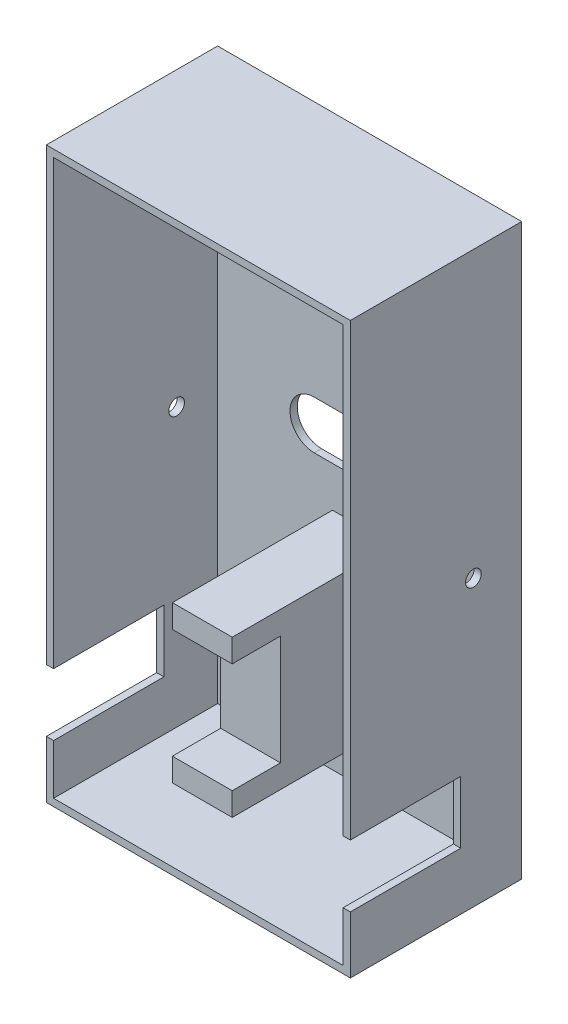
ISO-10303-21;
HEADER;
FILE_DESCRIPTION(('STEP AP214'),'2;1');
FILE_NAME('part.step','',(''),(''),'','','');
FILE_SCHEMA(('AUTOMOTIVE_DESIGN { 1 0 10303 214 1 1 1 1 }'));
ENDSEC;
DATA;
#1=APPLICATION_CONTEXT('core data for automotive mechanical design processes');
#2=APPLICATION_PROTOCOL_DEFINITION('international standard','automotive_design',2000,#1);
#3=PRODUCT_CONTEXT('',#1,'mechanical');
#4=PRODUCT('Part','Part','',(#3));
#5=PRODUCT_RELATED_PRODUCT_CATEGORY('part','',(#4));
#6=PRODUCT_DEFINITION_FORMATION('','',#4);
#7=PRODUCT_DEFINITION_CONTEXT('part definition',#1,'design');
#8=PRODUCT_DEFINITION('design','',#6,#7);
#9=PRODUCT_DEFINITION_SHAPE('','',#8);
#10=(LENGTH_UNIT() NAMED_UNIT(*) SI_UNIT(.MILLI.,.METRE.));
#11=(NAMED_UNIT(*) PLANE_ANGLE_UNIT() SI_UNIT($,.RADIAN.));
#12=(NAMED_UNIT(*) SI_UNIT($,.STERADIAN.) SOLID_ANGLE_UNIT());
#13=UNCERTAINTY_MEASURE_WITH_UNIT(LENGTH_MEASURE(1.E-05),#10,'distance_accuracy_value','');
#14=(GEOMETRIC_REPRESENTATION_CONTEXT(3) GLOBAL_UNCERTAINTY_ASSIGNED_CONTEXT((#13)) GLOBAL_UNIT_ASSIGNED_CONTEXT((#10,
#11,#12)) REPRESENTATION_CONTEXT('',''));
#15=CARTESIAN_POINT('',(0.,0.,0.));
#16=DIRECTION('',(0.,0.,1.));
#17=DIRECTION('',(1.,0.,0.));
#18=AXIS2_PLACEMENT_3D('',#15,#16,#17);
#19=CARTESIAN_POINT('',(0.,0.,-1.5));
#20=DIRECTION('',(0.,0.,1.));
#21=DIRECTION('',(1.,0.,0.));
#22=AXIS2_PLACEMENT_3D('',#19,#20,#21);
#23=PLANE('',#22);
#24=CARTESIAN_POINT('',(9.95,28.42,-1.5));
#25=DIRECTION('',(0.,0.,-1.));
#26=DIRECTION('',(-1.,0.,0.));
#27=AXIS2_PLACEMENT_3D('',#24,#25,#26);
#28=CIRCLE('',#27,1.52499999999999);
#29=CARTESIAN_POINT('',(8.42500000000001,28.42,-1.5));
#30=VERTEX_POINT('',#29);
#31=EDGE_CURVE('E896',#30,#30,#28,.T.);
#32=ORIENTED_EDGE('',*,*,#31,.F.);
#33=EDGE_LOOP('',(#32));
#34=FACE_BOUND('',#33,.T.);
#35=CARTESIAN_POINT('',(50.05,28.42,-1.5));
#36=DIRECTION('',(0.,0.,-1.));
#37=DIRECTION('',(-1.,0.,0.));
#38=AXIS2_PLACEMENT_3D('',#35,#36,#37);
#39=CIRCLE('',#38,1.52499999999998);
#40=CARTESIAN_POINT('',(48.525,28.42,-1.5));
#41=VERTEX_POINT('',#40);
#42=EDGE_CURVE('E884',#41,#41,#39,.T.);
#43=ORIENTED_EDGE('',*,*,#42,.F.);
#44=EDGE_LOOP('',(#43));
#45=FACE_BOUND('',#44,.T.);
#46=CARTESIAN_POINT('',(50.05,21.935,-1.5));
#47=DIRECTION('',(0.,0.,-1.));
#48=DIRECTION('',(-1.,0.,0.));
#49=AXIS2_PLACEMENT_3D('',#46,#47,#48);
#50=CIRCLE('',#49,1.52499999999998);
#51=CARTESIAN_POINT('',(48.525,21.935,-1.5));
#52=VERTEX_POINT('',#51);
#53=EDGE_CURVE('E879',#52,#52,#50,.T.);
#54=ORIENTED_EDGE('',*,*,#53,.F.);
#55=EDGE_LOOP('',(#54));
#56=FACE_BOUND('',#55,.T.);
#57=DIRECTION('',(-1.,0.,0.));
#58=VECTOR('',#57,1.);
#59=CARTESIAN_POINT('',(40.,55.,-1.5));
#60=LINE('',#59,#58);
#61=CARTESIAN_POINT('',(40.,55.,-1.5));
#62=VERTEX_POINT('',#61);
#63=CARTESIAN_POINT('',(20.,55.,-1.5));
#64=VERTEX_POINT('',#63);
#65=EDGE_CURVE('E233',#62,#64,#60,.T.);
#66=ORIENTED_EDGE('',*,*,#65,.F.);
#67=CARTESIAN_POINT('',(40.,60.,-1.5));
#68=DIRECTION('',(0.,0.,-1.));
#69=DIRECTION('',(-1.,0.,0.));
#70=AXIS2_PLACEMENT_3D('',#67,#68,#69);
#71=CIRCLE('',#70,5.);
#72=CARTESIAN_POINT('',(40.,65.,-1.5));
#73=VERTEX_POINT('',#72);
#74=EDGE_CURVE('E60',#73,#62,#71,.T.);
#75=ORIENTED_EDGE('',*,*,#74,.F.);
#76=DIRECTION('',(1.,0.,0.));
#77=VECTOR('',#76,1.);
#78=CARTESIAN_POINT('',(20.,65.,-1.5));
#79=LINE('',#78,#77);
#80=CARTESIAN_POINT('',(20.,65.,-1.5));
#81=VERTEX_POINT('',#80);
#82=EDGE_CURVE('E239',#81,#73,#79,.T.);
#83=ORIENTED_EDGE('',*,*,#82,.F.);
#84=CARTESIAN_POINT('',(20.,60.,-1.5));
#85=DIRECTION('',(0.,0.,-1.));
#86=DIRECTION('',(-1.,0.,0.));
#87=AXIS2_PLACEMENT_3D('',#84,#85,#86);
#88=CIRCLE('',#87,5.);
#89=EDGE_CURVE('E224',#64,#81,#88,.T.);
#90=ORIENTED_EDGE('',*,*,#89,.F.);
#91=EDGE_LOOP('',(#66,#75,#83,#90));
#92=FACE_BOUND('',#91,.T.);
#93=DIRECTION('',(0.,-1.,0.));
#94=VECTOR('',#93,1.);
#95=CARTESIAN_POINT('',(-1.5,116.5,-1.5));
#96=LINE('',#95,#94);
#97=CARTESIAN_POINT('',(-1.5,116.5,-1.5));
#98=VERTEX_POINT('',#97);
#99=CARTESIAN_POINT('',(-1.5,-1.5,-1.5));
#100=VERTEX_POINT('',#99);
#101=EDGE_CURVE('E403',#98,#100,#96,.T.);
#102=ORIENTED_EDGE('',*,*,#101,.F.);
#103=DIRECTION('',(-1.,0.,0.));
#104=VECTOR('',#103,1.);
#105=CARTESIAN_POINT('',(61.5,116.5,-1.5));
#106=LINE('',#105,#104);
#107=CARTESIAN_POINT('',(61.5,116.5,-1.5));
#108=VERTEX_POINT('',#107);
#109=EDGE_CURVE('E413',#108,#98,#106,.T.);
#110=ORIENTED_EDGE('',*,*,#109,.F.);
#111=DIRECTION('',(0.,1.,0.));
#112=VECTOR('',#111,1.);
#113=CARTESIAN_POINT('',(61.5,-1.5,-1.5));
#114=LINE('',#113,#112);
#115=CARTESIAN_POINT('',(61.5,-1.5,-1.5));
#116=VERTEX_POINT('',#115);
#117=EDGE_CURVE('E410',#116,#108,#114,.T.);
#118=ORIENTED_EDGE('',*,*,#117,.F.);
#119=DIRECTION('',(1.,0.,0.));
#120=VECTOR('',#119,1.);
#121=CARTESIAN_POINT('',(-1.5,-1.5,-1.5));
#122=LINE('',#121,#120);
#123=EDGE_CURVE('E406',#100,#116,#122,.T.);
#124=ORIENTED_EDGE('',*,*,#123,.F.);
#125=EDGE_LOOP('',(#102,#110,#118,#124));
#126=FACE_BOUND('',#125,.T.);
#127=CARTESIAN_POINT('',(9.95,21.935,-1.5));
#128=DIRECTION('',(0.,0.,-1.));
#129=DIRECTION('',(-1.,0.,0.));
#130=AXIS2_PLACEMENT_3D('',#127,#128,#129);
#131=CIRCLE('',#130,1.52499999999999);
#132=CARTESIAN_POINT('',(8.42500000000001,21.935,-1.5));
#133=VERTEX_POINT('',#132);
#134=EDGE_CURVE('E890',#133,#133,#131,.T.);
#135=ORIENTED_EDGE('',*,*,#134,.F.);
#136=EDGE_LOOP('',(#135));
#137=FACE_BOUND('',#136,.T.);
#138=ADVANCED_FACE('F35',(#34,#45,#56,#92,#126,#137),#23,.F.);
#139=CARTESIAN_POINT('',(0.,0.,34.));
#140=DIRECTION('',(0.,0.,1.));
#141=DIRECTION('',(1.,0.,0.));
#142=AXIS2_PLACEMENT_3D('',#139,#140,#141);
#143=PLANE('',#142);
#144=DIRECTION('',(-1.,0.,0.));
#145=VECTOR('',#144,1.);
#146=CARTESIAN_POINT('',(61.501,23.25,34.));
#147=LINE('',#146,#145);
#148=CARTESIAN_POINT('',(0.,23.25,34.));
#149=VERTEX_POINT('',#148);
#150=CARTESIAN_POINT('',(-1.5,23.25,34.));
#151=VERTEX_POINT('',#150);
#152=EDGE_CURVE('E277',#149,#151,#147,.T.);
#153=ORIENTED_EDGE('',*,*,#152,.F.);
#154=DIRECTION('',(0.,-1.,0.));
#155=VECTOR('',#154,1.);
#156=CARTESIAN_POINT('',(0.,115.,34.));
#157=LINE('',#156,#155);
#158=CARTESIAN_POINT('',(0.,115.,34.));
#159=VERTEX_POINT('',#158);
#160=EDGE_CURVE('E383',#159,#149,#157,.T.);
#161=ORIENTED_EDGE('',*,*,#160,.F.);
#162=DIRECTION('',(-1.,0.,0.));
#163=VECTOR('',#162,1.);
#164=CARTESIAN_POINT('',(60.,115.,34.));
#165=LINE('',#164,#163);
#166=CARTESIAN_POINT('',(60.,115.,34.));
#167=VERTEX_POINT('',#166);
#168=EDGE_CURVE('E366',#167,#159,#165,.T.);
#169=ORIENTED_EDGE('',*,*,#168,.F.);
#170=DIRECTION('',(0.,1.,0.));
#171=VECTOR('',#170,1.);
#172=CARTESIAN_POINT('',(60.,0.,34.));
#173=LINE('',#172,#171);
#174=CARTESIAN_POINT('',(60.,23.25,34.));
#175=VERTEX_POINT('',#174);
#176=EDGE_CURVE('E389',#175,#167,#173,.T.);
#177=ORIENTED_EDGE('',*,*,#176,.F.);
#178=DIRECTION('',(1.,0.,0.));
#179=VECTOR('',#178,1.);
#180=CARTESIAN_POINT('',(-1.501,23.25,34.));
#181=LINE('',#180,#179);
#182=CARTESIAN_POINT('',(61.5,23.25,34.));
#183=VERTEX_POINT('',#182);
#184=EDGE_CURVE('E296',#175,#183,#181,.T.);
#185=ORIENTED_EDGE('',*,*,#184,.T.);
#186=DIRECTION('',(0.,1.,0.));
#187=VECTOR('',#186,1.);
#188=CARTESIAN_POINT('',(61.5,-1.5,34.));
#189=LINE('',#188,#187);
#190=CARTESIAN_POINT('',(61.5,116.5,34.));
#191=VERTEX_POINT('',#190);
#192=EDGE_CURVE('E423',#183,#191,#189,.T.);
#193=ORIENTED_EDGE('',*,*,#192,.T.);
#194=DIRECTION('',(-1.,0.,0.));
#195=VECTOR('',#194,1.);
#196=CARTESIAN_POINT('',(61.5,116.5,34.));
#197=LINE('',#196,#195);
#198=CARTESIAN_POINT('',(-1.5,116.5,34.));
#199=VERTEX_POINT('',#198);
#200=EDGE_CURVE('E407',#191,#199,#197,.T.);
#201=ORIENTED_EDGE('',*,*,#200,.T.);
#202=DIRECTION('',(0.,-1.,0.));
#203=VECTOR('',#202,1.);
#204=CARTESIAN_POINT('',(-1.5,116.5,34.));
#205=LINE('',#204,#203);
#206=EDGE_CURVE('E417',#199,#151,#205,.T.);
#207=ORIENTED_EDGE('',*,*,#206,.T.);
#208=EDGE_LOOP('',(#153,#161,#169,#177,#185,#193,#201,#207));
#209=FACE_BOUND('',#208,.T.);
#210=ADVANCED_FACE('F462',(#209),#143,.T.);
#211=CARTESIAN_POINT('',(0.,0.,33.18));
#212=DIRECTION('',(0.,0.,1.));
#213=DIRECTION('',(1.,0.,0.));
#214=AXIS2_PLACEMENT_3D('',#211,#212,#213);
#215=PLANE('',#214);
#216=DIRECTION('',(-1.,0.,0.));
#217=VECTOR('',#216,1.);
#218=CARTESIAN_POINT('',(61.501,41.8,33.18));
#219=LINE('',#218,#217);
#220=CARTESIAN_POINT('',(36.2,41.8,33.18));
#221=VERTEX_POINT('',#220);
#222=CARTESIAN_POINT('',(23.8,41.8,33.18));
#223=VERTEX_POINT('',#222);
#224=EDGE_CURVE('E309',#221,#223,#219,.T.);
#225=ORIENTED_EDGE('',*,*,#224,.F.);
#226=DIRECTION('',(0.,1.,0.));
#227=VECTOR('',#226,1.);
#228=CARTESIAN_POINT('',(36.2,0.,33.18));
#229=LINE('',#228,#227);
#230=CARTESIAN_POINT('',(36.2,46.6,33.18));
#231=VERTEX_POINT('',#230);
#232=EDGE_CURVE('E334',#221,#231,#229,.T.);
#233=ORIENTED_EDGE('',*,*,#232,.T.);
#234=DIRECTION('',(1.,0.,0.));
#235=VECTOR('',#234,1.);
#236=CARTESIAN_POINT('',(0.,46.6,33.18));
#237=LINE('',#236,#235);
#238=CARTESIAN_POINT('',(23.8,46.6,33.18));
#239=VERTEX_POINT('',#238);
#240=EDGE_CURVE('E339',#239,#231,#237,.T.);
#241=ORIENTED_EDGE('',*,*,#240,.F.);
#242=DIRECTION('',(0.,1.,0.));
#243=VECTOR('',#242,1.);
#244=CARTESIAN_POINT('',(23.8,0.,33.18));
#245=LINE('',#244,#243);
#246=EDGE_CURVE('E342',#223,#239,#245,.T.);
#247=ORIENTED_EDGE('',*,*,#246,.F.);
#248=EDGE_LOOP('',(#225,#233,#241,#247));
#249=FACE_BOUND('',#248,.T.);
#250=ADVANCED_FACE('F518',(#249),#215,.T.);
#251=CARTESIAN_POINT('',(0.,0.,0.));
#252=DIRECTION('',(0.,0.,1.));
#253=DIRECTION('',(1.,0.,0.));
#254=AXIS2_PLACEMENT_3D('',#251,#252,#253);
#255=PLANE('',#254);
#256=CARTESIAN_POINT('',(9.95,28.42,0.));
#257=DIRECTION('',(0.,0.,1.));
#258=DIRECTION('',(1.,0.,0.));
#259=AXIS2_PLACEMENT_3D('',#256,#257,#258);
#260=CIRCLE('',#259,1.52499999999999);
#261=CARTESIAN_POINT('',(11.475,28.42,0.));
#262=VERTEX_POINT('',#261);
#263=EDGE_CURVE('E893',#262,#262,#260,.T.);
#264=ORIENTED_EDGE('',*,*,#263,.F.);
#265=EDGE_LOOP('',(#264));
#266=FACE_BOUND('',#265,.T.);
#267=CARTESIAN_POINT('',(9.95,21.935,0.));
#268=DIRECTION('',(0.,0.,1.));
#269=DIRECTION('',(1.,0.,0.));
#270=AXIS2_PLACEMENT_3D('',#267,#268,#269);
#271=CIRCLE('',#270,1.52499999999999);
#272=CARTESIAN_POINT('',(11.475,21.935,0.));
#273=VERTEX_POINT('',#272);
#274=EDGE_CURVE('E887',#273,#273,#271,.T.);
#275=ORIENTED_EDGE('',*,*,#274,.F.);
#276=EDGE_LOOP('',(#275));
#277=FACE_BOUND('',#276,.T.);
#278=CARTESIAN_POINT('',(50.05,28.42,0.));
#279=DIRECTION('',(0.,0.,1.));
#280=DIRECTION('',(1.,0.,0.));
#281=AXIS2_PLACEMENT_3D('',#278,#279,#280);
#282=CIRCLE('',#281,1.52499999999998);
#283=CARTESIAN_POINT('',(51.575,28.42,0.));
#284=VERTEX_POINT('',#283);
#285=EDGE_CURVE('E39',#284,#284,#282,.T.);
#286=ORIENTED_EDGE('',*,*,#285,.F.);
#287=EDGE_LOOP('',(#286));
#288=FACE_BOUND('',#287,.T.);
#289=CARTESIAN_POINT('',(50.05,21.935,0.));
#290=DIRECTION('',(0.,0.,1.));
#291=DIRECTION('',(1.,0.,0.));
#292=AXIS2_PLACEMENT_3D('',#289,#290,#291);
#293=CIRCLE('',#292,1.52499999999998);
#294=CARTESIAN_POINT('',(51.575,21.935,0.));
#295=VERTEX_POINT('',#294);
#296=EDGE_CURVE('E877',#295,#295,#293,.T.);
#297=ORIENTED_EDGE('',*,*,#296,.F.);
#298=EDGE_LOOP('',(#297));
#299=FACE_BOUND('',#298,.T.);
#300=CARTESIAN_POINT('',(40.,60.,0.));
#301=DIRECTION('',(0.,0.,1.));
#302=DIRECTION('',(1.,0.,0.));
#303=AXIS2_PLACEMENT_3D('',#300,#301,#302);
#304=CIRCLE('',#303,5.);
#305=CARTESIAN_POINT('',(40.,55.,0.));
#306=VERTEX_POINT('',#305);
#307=CARTESIAN_POINT('',(40.,65.,0.));
#308=VERTEX_POINT('',#307);
#309=EDGE_CURVE('E253',#306,#308,#304,.T.);
#310=ORIENTED_EDGE('',*,*,#309,.F.);
#311=DIRECTION('',(1.,0.,0.));
#312=VECTOR('',#311,1.);
#313=CARTESIAN_POINT('',(0.,55.,0.));
#314=LINE('',#313,#312);
#315=CARTESIAN_POINT('',(20.,55.,0.));
#316=VERTEX_POINT('',#315);
#317=EDGE_CURVE('E246',#316,#306,#314,.T.);
#318=ORIENTED_EDGE('',*,*,#317,.F.);
#319=CARTESIAN_POINT('',(20.,60.,0.));
#320=DIRECTION('',(0.,0.,1.));
#321=DIRECTION('',(1.,0.,0.));
#322=AXIS2_PLACEMENT_3D('',#319,#320,#321);
#323=CIRCLE('',#322,5.);
#324=CARTESIAN_POINT('',(20.,65.,0.));
#325=VERTEX_POINT('',#324);
#326=EDGE_CURVE('E227',#325,#316,#323,.T.);
#327=ORIENTED_EDGE('',*,*,#326,.F.);
#328=DIRECTION('',(-1.,0.,0.));
#329=VECTOR('',#328,1.);
#330=CARTESIAN_POINT('',(0.,65.,0.));
#331=LINE('',#330,#329);
#332=EDGE_CURVE('E251',#308,#325,#331,.T.);
#333=ORIENTED_EDGE('',*,*,#332,.F.);
#334=EDGE_LOOP('',(#310,#318,#327,#333));
#335=FACE_BOUND('',#334,.T.);
#336=DIRECTION('',(-1.,0.,0.));
#337=VECTOR('',#336,1.);
#338=CARTESIAN_POINT('',(60.,115.,0.));
#339=LINE('',#338,#337);
#340=CARTESIAN_POINT('',(60.,115.,0.));
#341=VERTEX_POINT('',#340);
#342=CARTESIAN_POINT('',(0.,115.,0.));
#343=VERTEX_POINT('',#342);
#344=EDGE_CURVE('E367',#341,#343,#339,.T.);
#345=ORIENTED_EDGE('',*,*,#344,.T.);
#346=DIRECTION('',(0.,-1.,0.));
#347=VECTOR('',#346,1.);
#348=CARTESIAN_POINT('',(0.,115.,0.));
#349=LINE('',#348,#347);
#350=CARTESIAN_POINT('',(0.,0.,0.));
#351=VERTEX_POINT('',#350);
#352=EDGE_CURVE('E370',#343,#351,#349,.T.);
#353=ORIENTED_EDGE('',*,*,#352,.T.);
#354=DIRECTION('',(1.,0.,0.));
#355=VECTOR('',#354,1.);
#356=CARTESIAN_POINT('',(0.,0.,0.));
#357=LINE('',#356,#355);
#358=CARTESIAN_POINT('',(60.,0.,0.));
#359=VERTEX_POINT('',#358);
#360=EDGE_CURVE('E374',#351,#359,#357,.T.);
#361=ORIENTED_EDGE('',*,*,#360,.T.);
#362=DIRECTION('',(0.,1.,0.));
#363=VECTOR('',#362,1.);
#364=CARTESIAN_POINT('',(60.,0.,0.));
#365=LINE('',#364,#363);
#366=EDGE_CURVE('E377',#359,#341,#365,.T.);
#367=ORIENTED_EDGE('',*,*,#366,.T.);
#368=EDGE_LOOP('',(#345,#353,#361,#367));
#369=FACE_BOUND('',#368,.T.);
#370=DIRECTION('',(0.,1.,0.));
#371=VECTOR('',#370,1.);
#372=CARTESIAN_POINT('',(36.2,0.,0.));
#373=LINE('',#372,#371);
#374=CARTESIAN_POINT('',(36.2,14.25,0.));
#375=VERTEX_POINT('',#374);
#376=CARTESIAN_POINT('',(36.2,46.6,0.));
#377=VERTEX_POINT('',#376);
#378=EDGE_CURVE('E349',#375,#377,#373,.T.);
#379=ORIENTED_EDGE('',*,*,#378,.F.);
#380=DIRECTION('',(1.,0.,0.));
#381=VECTOR('',#380,1.);
#382=CARTESIAN_POINT('',(0.,14.25,0.));
#383=LINE('',#382,#381);
#384=CARTESIAN_POINT('',(23.8,14.25,0.));
#385=VERTEX_POINT('',#384);
#386=EDGE_CURVE('E330',#385,#375,#383,.T.);
#387=ORIENTED_EDGE('',*,*,#386,.F.);
#388=DIRECTION('',(0.,1.,0.));
#389=VECTOR('',#388,1.);
#390=CARTESIAN_POINT('',(23.8,0.,0.));
#391=LINE('',#390,#389);
#392=CARTESIAN_POINT('',(23.8,46.6,0.));
#393=VERTEX_POINT('',#392);
#394=EDGE_CURVE('E335',#385,#393,#391,.T.);
#395=ORIENTED_EDGE('',*,*,#394,.T.);
#396=DIRECTION('',(1.,0.,0.));
#397=VECTOR('',#396,1.);
#398=CARTESIAN_POINT('',(0.,46.6,0.));
#399=LINE('',#398,#397);
#400=EDGE_CURVE('E352',#393,#377,#399,.T.);
#401=ORIENTED_EDGE('',*,*,#400,.T.);
#402=EDGE_LOOP('',(#379,#387,#395,#401));
#403=FACE_BOUND('',#402,.T.);
#404=ADVANCED_FACE('F490',(#266,#277,#288,#299,#335,#369,#403),#255,.T.);
#405=CARTESIAN_POINT('',(-1.5,116.5,-1.5));
#406=DIRECTION('',(-1.,0.,0.));
#407=DIRECTION('',(0.,-1.,0.));
#408=AXIS2_PLACEMENT_3D('',#405,#406,#407);
#409=PLANE('',#408);
#410=CARTESIAN_POINT('',(-1.5,57.5,8.5));
#411=DIRECTION('',(1.,0.,0.));
#412=DIRECTION('',(0.,0.,-1.));
#413=AXIS2_PLACEMENT_3D('',#410,#411,#412);
#414=CIRCLE('',#413,1.62559999999998);
#415=CARTESIAN_POINT('',(-1.5,57.5,6.87440000000002));
#416=VERTEX_POINT('',#415);
#417=EDGE_CURVE('E899',#416,#416,#414,.T.);
#418=ORIENTED_EDGE('',*,*,#417,.T.);
#419=EDGE_LOOP('',(#418));
#420=FACE_BOUND('',#419,.T.);
#421=DIRECTION('',(0.,0.,-1.));
#422=VECTOR('',#421,1.);
#423=CARTESIAN_POINT('',(-1.5,23.25,34.));
#424=LINE('',#423,#422);
#425=CARTESIAN_POINT('',(-1.5,23.25,11.13));
#426=VERTEX_POINT('',#425);
#427=EDGE_CURVE('E265',#151,#426,#424,.T.);
#428=ORIENTED_EDGE('',*,*,#427,.F.);
#429=ORIENTED_EDGE('',*,*,#206,.F.);
#430=DIRECTION('',(0.,0.,1.));
#431=VECTOR('',#430,1.);
#432=CARTESIAN_POINT('',(-1.5,116.5,-1.5));
#433=LINE('',#432,#431);
#434=EDGE_CURVE('E11',#98,#199,#433,.T.);
#435=ORIENTED_EDGE('',*,*,#434,.F.);
#436=ORIENTED_EDGE('',*,*,#101,.T.);
#437=DIRECTION('',(0.,0.,1.));
#438=VECTOR('',#437,1.);
#439=CARTESIAN_POINT('',(-1.5,-1.5,-1.5));
#440=LINE('',#439,#438);
#441=CARTESIAN_POINT('',(-1.5,-1.5,34.));
#442=VERTEX_POINT('',#441);
#443=EDGE_CURVE('E416',#100,#442,#440,.T.);
#444=ORIENTED_EDGE('',*,*,#443,.T.);
#445=CARTESIAN_POINT('',(-1.5,10.36,34.));
#446=VERTEX_POINT('',#445);
#447=EDGE_CURVE('E395',#446,#442,#205,.T.);
#448=ORIENTED_EDGE('',*,*,#447,.F.);
#449=DIRECTION('',(0.,0.,1.));
#450=VECTOR('',#449,1.);
#451=CARTESIAN_POINT('',(-1.5,10.36,11.13));
#452=LINE('',#451,#450);
#453=CARTESIAN_POINT('',(-1.5,10.36,11.13));
#454=VERTEX_POINT('',#453);
#455=EDGE_CURVE('E263',#454,#446,#452,.T.);
#456=ORIENTED_EDGE('',*,*,#455,.F.);
#457=DIRECTION('',(0.,-1.,0.));
#458=VECTOR('',#457,1.);
#459=CARTESIAN_POINT('',(-1.5,23.25,11.13));
#460=LINE('',#459,#458);
#461=EDGE_CURVE('E268',#426,#454,#460,.T.);
#462=ORIENTED_EDGE('',*,*,#461,.F.);
#463=EDGE_LOOP('',(#428,#429,#435,#436,#444,#448,#456,#462));
#464=FACE_BOUND('',#463,.T.);
#465=ADVANCED_FACE('F37',(#420,#464),#409,.T.);
#466=CARTESIAN_POINT('',(61.5,116.5,-1.5));
#467=DIRECTION('',(0.,1.,0.));
#468=DIRECTION('',(0.,0.,1.));
#469=AXIS2_PLACEMENT_3D('',#466,#467,#468);
#470=PLANE('',#469);
#471=ORIENTED_EDGE('',*,*,#200,.F.);
#472=DIRECTION('',(0.,0.,1.));
#473=VECTOR('',#472,1.);
#474=CARTESIAN_POINT('',(61.5,116.5,-1.5));
#475=LINE('',#474,#473);
#476=EDGE_CURVE('E44',#108,#191,#475,.T.);
#477=ORIENTED_EDGE('',*,*,#476,.F.);
#478=ORIENTED_EDGE('',*,*,#109,.T.);
#479=ORIENTED_EDGE('',*,*,#434,.T.);
#480=EDGE_LOOP('',(#471,#477,#478,#479));
#481=FACE_BOUND('',#480,.T.);
#482=ADVANCED_FACE('F467',(#481),#470,.T.);
#483=CARTESIAN_POINT('',(61.5,-1.5,-1.5));
#484=DIRECTION('',(1.,0.,0.));
#485=DIRECTION('',(0.,0.,-1.));
#486=AXIS2_PLACEMENT_3D('',#483,#484,#485);
#487=PLANE('',#486);
#488=CARTESIAN_POINT('',(61.5,57.5,8.5));
#489=DIRECTION('',(1.,0.,0.));
#490=DIRECTION('',(0.,0.,-1.));
#491=AXIS2_PLACEMENT_3D('',#488,#489,#490);
#492=CIRCLE('',#491,1.62559999999998);
#493=CARTESIAN_POINT('',(61.5,57.5,6.87440000000002));
#494=VERTEX_POINT('',#493);
#495=EDGE_CURVE('E908',#494,#494,#492,.T.);
#496=ORIENTED_EDGE('',*,*,#495,.F.);
#497=EDGE_LOOP('',(#496));
#498=FACE_BOUND('',#497,.T.);
#499=DIRECTION('',(0.,0.,-1.));
#500=VECTOR('',#499,1.);
#501=CARTESIAN_POINT('',(61.5,10.36,34.));
#502=LINE('',#501,#500);
#503=CARTESIAN_POINT('',(61.5,10.36,34.));
#504=VERTEX_POINT('',#503);
#505=CARTESIAN_POINT('',(61.5,10.36,11.13));
#506=VERTEX_POINT('',#505);
#507=EDGE_CURVE('E290',#504,#506,#502,.T.);
#508=ORIENTED_EDGE('',*,*,#507,.F.);
#509=CARTESIAN_POINT('',(61.5,-1.5,34.));
#510=VERTEX_POINT('',#509);
#511=EDGE_CURVE('E424',#510,#504,#189,.T.);
#512=ORIENTED_EDGE('',*,*,#511,.F.);
#513=DIRECTION('',(0.,0.,1.));
#514=VECTOR('',#513,1.);
#515=CARTESIAN_POINT('',(61.5,-1.5,-1.5));
#516=LINE('',#515,#514);
#517=EDGE_CURVE('E431',#116,#510,#516,.T.);
#518=ORIENTED_EDGE('',*,*,#517,.F.);
#519=ORIENTED_EDGE('',*,*,#117,.T.);
#520=ORIENTED_EDGE('',*,*,#476,.T.);
#521=ORIENTED_EDGE('',*,*,#192,.F.);
#522=DIRECTION('',(0.,0.,1.));
#523=VECTOR('',#522,1.);
#524=CARTESIAN_POINT('',(61.5,23.25,11.13));
#525=LINE('',#524,#523);
#526=CARTESIAN_POINT('',(61.5,23.25,11.13));
#527=VERTEX_POINT('',#526);
#528=EDGE_CURVE('E288',#527,#183,#525,.T.);
#529=ORIENTED_EDGE('',*,*,#528,.F.);
#530=DIRECTION('',(0.,1.,0.));
#531=VECTOR('',#530,1.);
#532=CARTESIAN_POINT('',(61.5,10.36,11.13));
#533=LINE('',#532,#531);
#534=EDGE_CURVE('E293',#506,#527,#533,.T.);
#535=ORIENTED_EDGE('',*,*,#534,.F.);
#536=EDGE_LOOP('',(#508,#512,#518,#519,#520,#521,#529,#535));
#537=FACE_BOUND('',#536,.T.);
#538=ADVANCED_FACE('F473',(#498,#537),#487,.T.);
#539=CARTESIAN_POINT('',(-1.5,-1.5,-1.5));
#540=DIRECTION('',(0.,-1.,0.));
#541=DIRECTION('',(1.,0.,0.));
#542=AXIS2_PLACEMENT_3D('',#539,#540,#541);
#543=PLANE('',#542);
#544=DIRECTION('',(1.,0.,0.));
#545=VECTOR('',#544,1.);
#546=CARTESIAN_POINT('',(-1.5,-1.5,34.));
#547=LINE('',#546,#545);
#548=EDGE_CURVE('E420',#442,#510,#547,.T.);
#549=ORIENTED_EDGE('',*,*,#548,.F.);
#550=ORIENTED_EDGE('',*,*,#443,.F.);
#551=ORIENTED_EDGE('',*,*,#123,.T.);
#552=ORIENTED_EDGE('',*,*,#517,.T.);
#553=EDGE_LOOP('',(#549,#550,#551,#552));
#554=FACE_BOUND('',#553,.T.);
#555=ADVANCED_FACE('F441',(#554),#543,.T.);
#556=DIRECTION('',(-1.,0.,0.));
#557=VECTOR('',#556,1.);
#558=CARTESIAN_POINT('',(61.501,10.36,34.));
#559=LINE('',#558,#557);
#560=CARTESIAN_POINT('',(0.,10.36,34.));
#561=VERTEX_POINT('',#560);
#562=EDGE_CURVE('E271',#561,#446,#559,.T.);
#563=ORIENTED_EDGE('',*,*,#562,.T.);
#564=ORIENTED_EDGE('',*,*,#447,.T.);
#565=ORIENTED_EDGE('',*,*,#548,.T.);
#566=ORIENTED_EDGE('',*,*,#511,.T.);
#567=DIRECTION('',(1.,0.,0.));
#568=VECTOR('',#567,1.);
#569=CARTESIAN_POINT('',(-1.501,10.36,34.));
#570=LINE('',#569,#568);
#571=CARTESIAN_POINT('',(60.,10.36,34.));
#572=VERTEX_POINT('',#571);
#573=EDGE_CURVE('E302',#572,#504,#570,.T.);
#574=ORIENTED_EDGE('',*,*,#573,.F.);
#575=CARTESIAN_POINT('',(60.,0.,34.));
#576=VERTEX_POINT('',#575);
#577=EDGE_CURVE('E371',#576,#572,#173,.T.);
#578=ORIENTED_EDGE('',*,*,#577,.F.);
#579=DIRECTION('',(1.,0.,0.));
#580=VECTOR('',#579,1.);
#581=CARTESIAN_POINT('',(0.,0.,34.));
#582=LINE('',#581,#580);
#583=CARTESIAN_POINT('',(0.,0.,34.));
#584=VERTEX_POINT('',#583);
#585=EDGE_CURVE('E386',#584,#576,#582,.T.);
#586=ORIENTED_EDGE('',*,*,#585,.F.);
#587=EDGE_CURVE('E382',#561,#584,#157,.T.);
#588=ORIENTED_EDGE('',*,*,#587,.F.);
#589=EDGE_LOOP('',(#563,#564,#565,#566,#574,#578,#586,#588));
#590=FACE_BOUND('',#589,.T.);
#591=ADVANCED_FACE('F444',(#590),#143,.T.);
#592=CARTESIAN_POINT('',(60.,115.,0.));
#593=DIRECTION('',(0.,1.,0.));
#594=DIRECTION('',(0.,0.,1.));
#595=AXIS2_PLACEMENT_3D('',#592,#593,#594);
#596=PLANE('',#595);
#597=ORIENTED_EDGE('',*,*,#168,.T.);
#598=DIRECTION('',(0.,0.,1.));
#599=VECTOR('',#598,1.);
#600=CARTESIAN_POINT('',(0.,115.,0.));
#601=LINE('',#600,#599);
#602=EDGE_CURVE('E380',#343,#159,#601,.T.);
#603=ORIENTED_EDGE('',*,*,#602,.F.);
#604=ORIENTED_EDGE('',*,*,#344,.F.);
#605=DIRECTION('',(0.,0.,1.));
#606=VECTOR('',#605,1.);
#607=CARTESIAN_POINT('',(60.,115.,0.));
#608=LINE('',#607,#606);
#609=EDGE_CURVE('E392',#341,#167,#608,.T.);
#610=ORIENTED_EDGE('',*,*,#609,.T.);
#611=EDGE_LOOP('',(#597,#603,#604,#610));
#612=FACE_BOUND('',#611,.T.);
#613=ADVANCED_FACE('F493',(#612),#596,.F.);
#614=CARTESIAN_POINT('',(60.,0.,0.));
#615=DIRECTION('',(1.,0.,0.));
#616=DIRECTION('',(0.,0.,-1.));
#617=AXIS2_PLACEMENT_3D('',#614,#615,#616);
#618=PLANE('',#617);
#619=CARTESIAN_POINT('',(60.,57.5,8.5));
#620=DIRECTION('',(1.,0.,0.));
#621=DIRECTION('',(0.,0.,-1.));
#622=AXIS2_PLACEMENT_3D('',#619,#620,#621);
#623=CIRCLE('',#622,1.62559999999998);
#624=CARTESIAN_POINT('',(60.,57.5,6.87440000000002));
#625=VERTEX_POINT('',#624);
#626=EDGE_CURVE('E905',#625,#625,#623,.T.);
#627=ORIENTED_EDGE('',*,*,#626,.T.);
#628=EDGE_LOOP('',(#627));
#629=FACE_BOUND('',#628,.T.);
#630=ORIENTED_EDGE('',*,*,#577,.T.);
#631=DIRECTION('',(0.,0.,1.));
#632=VECTOR('',#631,1.);
#633=CARTESIAN_POINT('',(60.,10.36,34.));
#634=LINE('',#633,#632);
#635=CARTESIAN_POINT('',(60.,10.36,11.13));
#636=VERTEX_POINT('',#635);
#637=EDGE_CURVE('E274',#636,#572,#634,.T.);
#638=ORIENTED_EDGE('',*,*,#637,.F.);
#639=DIRECTION('',(0.,-1.,0.));
#640=VECTOR('',#639,1.);
#641=CARTESIAN_POINT('',(60.,10.36,11.13));
#642=LINE('',#641,#640);
#643=CARTESIAN_POINT('',(60.,23.25,11.13));
#644=VERTEX_POINT('',#643);
#645=EDGE_CURVE('E282',#644,#636,#642,.T.);
#646=ORIENTED_EDGE('',*,*,#645,.F.);
#647=DIRECTION('',(0.,0.,-1.));
#648=VECTOR('',#647,1.);
#649=CARTESIAN_POINT('',(60.,23.25,11.13));
#650=LINE('',#649,#648);
#651=EDGE_CURVE('E285',#175,#644,#650,.T.);
#652=ORIENTED_EDGE('',*,*,#651,.F.);
#653=ORIENTED_EDGE('',*,*,#176,.T.);
#654=ORIENTED_EDGE('',*,*,#609,.F.);
#655=ORIENTED_EDGE('',*,*,#366,.F.);
#656=DIRECTION('',(0.,0.,1.));
#657=VECTOR('',#656,1.);
#658=CARTESIAN_POINT('',(60.,0.,0.));
#659=LINE('',#658,#657);
#660=EDGE_CURVE('E396',#359,#576,#659,.T.);
#661=ORIENTED_EDGE('',*,*,#660,.T.);
#662=EDGE_LOOP('',(#630,#638,#646,#652,#653,#654,#655,#661));
#663=FACE_BOUND('',#662,.T.);
#664=ADVANCED_FACE('F481',(#629,#663),#618,.F.);
#665=CARTESIAN_POINT('',(0.,0.,0.));
#666=DIRECTION('',(0.,-1.,0.));
#667=DIRECTION('',(0.,0.,-1.));
#668=AXIS2_PLACEMENT_3D('',#665,#666,#667);
#669=PLANE('',#668);
#670=ORIENTED_EDGE('',*,*,#585,.T.);
#671=ORIENTED_EDGE('',*,*,#660,.F.);
#672=ORIENTED_EDGE('',*,*,#360,.F.);
#673=DIRECTION('',(0.,0.,1.));
#674=VECTOR('',#673,1.);
#675=CARTESIAN_POINT('',(0.,0.,0.));
#676=LINE('',#675,#674);
#677=EDGE_CURVE('E398',#351,#584,#676,.T.);
#678=ORIENTED_EDGE('',*,*,#677,.T.);
#679=EDGE_LOOP('',(#670,#671,#672,#678));
#680=FACE_BOUND('',#679,.T.);
#681=ADVANCED_FACE('F486',(#680),#669,.F.);
#682=CARTESIAN_POINT('',(0.,115.,0.));
#683=DIRECTION('',(-1.,0.,0.));
#684=DIRECTION('',(0.,0.,1.));
#685=AXIS2_PLACEMENT_3D('',#682,#683,#684);
#686=PLANE('',#685);
#687=CARTESIAN_POINT('',(0.,57.5,8.5));
#688=DIRECTION('',(1.,0.,0.));
#689=DIRECTION('',(0.,0.,-1.));
#690=AXIS2_PLACEMENT_3D('',#687,#688,#689);
#691=CIRCLE('',#690,1.62559999999998);
#692=CARTESIAN_POINT('',(0.,57.5,6.87440000000002));
#693=VERTEX_POINT('',#692);
#694=EDGE_CURVE('E902',#693,#693,#691,.T.);
#695=ORIENTED_EDGE('',*,*,#694,.F.);
#696=EDGE_LOOP('',(#695));
#697=FACE_BOUND('',#696,.T.);
#698=ORIENTED_EDGE('',*,*,#160,.T.);
#699=DIRECTION('',(0.,0.,1.));
#700=VECTOR('',#699,1.);
#701=CARTESIAN_POINT('',(0.,23.25,34.));
#702=LINE('',#701,#700);
#703=CARTESIAN_POINT('',(0.,23.25,11.13));
#704=VERTEX_POINT('',#703);
#705=EDGE_CURVE('E255',#704,#149,#702,.T.);
#706=ORIENTED_EDGE('',*,*,#705,.F.);
#707=DIRECTION('',(0.,1.,0.));
#708=VECTOR('',#707,1.);
#709=CARTESIAN_POINT('',(0.,23.25,11.13));
#710=LINE('',#709,#708);
#711=CARTESIAN_POINT('',(0.,10.36,11.13));
#712=VERTEX_POINT('',#711);
#713=EDGE_CURVE('E257',#712,#704,#710,.T.);
#714=ORIENTED_EDGE('',*,*,#713,.F.);
#715=DIRECTION('',(0.,0.,-1.));
#716=VECTOR('',#715,1.);
#717=CARTESIAN_POINT('',(0.,10.36,11.13));
#718=LINE('',#717,#716);
#719=EDGE_CURVE('E260',#561,#712,#718,.T.);
#720=ORIENTED_EDGE('',*,*,#719,.F.);
#721=ORIENTED_EDGE('',*,*,#587,.T.);
#722=ORIENTED_EDGE('',*,*,#677,.F.);
#723=ORIENTED_EDGE('',*,*,#352,.F.);
#724=ORIENTED_EDGE('',*,*,#602,.T.);
#725=EDGE_LOOP('',(#698,#706,#714,#720,#721,#722,#723,#724));
#726=FACE_BOUND('',#725,.T.);
#727=ADVANCED_FACE('F453',(#697,#726),#686,.F.);
#728=CARTESIAN_POINT('',(0.,14.25,33.18));
#729=DIRECTION('',(0.,1.,0.));
#730=DIRECTION('',(0.,0.,1.));
#731=AXIS2_PLACEMENT_3D('',#728,#729,#730);
#732=PLANE('',#731);
#733=ORIENTED_EDGE('',*,*,#386,.T.);
#734=DIRECTION('',(0.,0.,-1.));
#735=VECTOR('',#734,1.);
#736=CARTESIAN_POINT('',(36.2,14.25,33.18));
#737=LINE('',#736,#735);
#738=CARTESIAN_POINT('',(36.2,14.25,33.18));
#739=VERTEX_POINT('',#738);
#740=EDGE_CURVE('E363',#739,#375,#737,.T.);
#741=ORIENTED_EDGE('',*,*,#740,.F.);
#742=DIRECTION('',(1.,0.,0.));
#743=VECTOR('',#742,1.);
#744=CARTESIAN_POINT('',(0.,14.25,33.18));
#745=LINE('',#744,#743);
#746=CARTESIAN_POINT('',(23.8,14.25,33.18));
#747=VERTEX_POINT('',#746);
#748=EDGE_CURVE('E331',#747,#739,#745,.T.);
#749=ORIENTED_EDGE('',*,*,#748,.F.);
#750=DIRECTION('',(0.,0.,-1.));
#751=VECTOR('',#750,1.);
#752=CARTESIAN_POINT('',(23.8,14.25,33.18));
#753=LINE('',#752,#751);
#754=EDGE_CURVE('E346',#747,#385,#753,.T.);
#755=ORIENTED_EDGE('',*,*,#754,.T.);
#756=EDGE_LOOP('',(#733,#741,#749,#755));
#757=FACE_BOUND('',#756,.T.);
#758=ADVANCED_FACE('F568',(#757),#732,.F.);
#759=CARTESIAN_POINT('',(36.2,0.,33.18));
#760=DIRECTION('',(-1.,0.,0.));
#761=DIRECTION('',(0.,0.,1.));
#762=AXIS2_PLACEMENT_3D('',#759,#760,#761);
#763=PLANE('',#762);
#764=ORIENTED_EDGE('',*,*,#232,.F.);
#765=DIRECTION('',(0.,0.,1.));
#766=VECTOR('',#765,1.);
#767=CARTESIAN_POINT('',(36.2,41.8,33.18));
#768=LINE('',#767,#766);
#769=CARTESIAN_POINT('',(36.2,41.8,23.18));
#770=VERTEX_POINT('',#769);
#771=EDGE_CURVE('E315',#770,#221,#768,.T.);
#772=ORIENTED_EDGE('',*,*,#771,.F.);
#773=DIRECTION('',(0.,1.,0.));
#774=VECTOR('',#773,1.);
#775=CARTESIAN_POINT('',(36.2,41.8,23.18));
#776=LINE('',#775,#774);
#777=CARTESIAN_POINT('',(36.2,19.05,23.18));
#778=VERTEX_POINT('',#777);
#779=EDGE_CURVE('E318',#778,#770,#776,.T.);
#780=ORIENTED_EDGE('',*,*,#779,.F.);
#781=DIRECTION('',(0.,0.,-1.));
#782=VECTOR('',#781,1.);
#783=CARTESIAN_POINT('',(36.2,19.05,23.18));
#784=LINE('',#783,#782);
#785=CARTESIAN_POINT('',(36.2,19.05,33.18));
#786=VERTEX_POINT('',#785);
#787=EDGE_CURVE('E299',#786,#778,#784,.T.);
#788=ORIENTED_EDGE('',*,*,#787,.F.);
#789=EDGE_CURVE('E336',#739,#786,#229,.T.);
#790=ORIENTED_EDGE('',*,*,#789,.F.);
#791=ORIENTED_EDGE('',*,*,#740,.T.);
#792=ORIENTED_EDGE('',*,*,#378,.T.);
#793=DIRECTION('',(0.,0.,-1.));
#794=VECTOR('',#793,1.);
#795=CARTESIAN_POINT('',(36.2,46.6,33.18));
#796=LINE('',#795,#794);
#797=EDGE_CURVE('E360',#231,#377,#796,.T.);
#798=ORIENTED_EDGE('',*,*,#797,.F.);
#799=EDGE_LOOP('',(#764,#772,#780,#788,#790,#791,#792,#798));
#800=FACE_BOUND('',#799,.T.);
#801=ADVANCED_FACE('F576',(#800),#763,.F.);
#802=CARTESIAN_POINT('',(0.,46.6,33.18));
#803=DIRECTION('',(0.,1.,0.));
#804=DIRECTION('',(0.,0.,1.));
#805=AXIS2_PLACEMENT_3D('',#802,#803,#804);
#806=PLANE('',#805);
#807=ORIENTED_EDGE('',*,*,#400,.F.);
#808=DIRECTION('',(0.,0.,-1.));
#809=VECTOR('',#808,1.);
#810=CARTESIAN_POINT('',(23.8,46.6,33.18));
#811=LINE('',#810,#809);
#812=EDGE_CURVE('E357',#239,#393,#811,.T.);
#813=ORIENTED_EDGE('',*,*,#812,.F.);
#814=ORIENTED_EDGE('',*,*,#240,.T.);
#815=ORIENTED_EDGE('',*,*,#797,.T.);
#816=EDGE_LOOP('',(#807,#813,#814,#815));
#817=FACE_BOUND('',#816,.T.);
#818=ADVANCED_FACE('F585',(#817),#806,.T.);
#819=CARTESIAN_POINT('',(23.8,0.,33.18));
#820=DIRECTION('',(-1.,0.,0.));
#821=DIRECTION('',(0.,0.,1.));
#822=AXIS2_PLACEMENT_3D('',#819,#820,#821);
#823=PLANE('',#822);
#824=DIRECTION('',(0.,0.,-1.));
#825=VECTOR('',#824,1.);
#826=CARTESIAN_POINT('',(23.8,41.8,33.18));
#827=LINE('',#826,#825);
#828=CARTESIAN_POINT('',(23.8,41.8,23.18));
#829=VERTEX_POINT('',#828);
#830=EDGE_CURVE('E310',#223,#829,#827,.T.);
#831=ORIENTED_EDGE('',*,*,#830,.F.);
#832=ORIENTED_EDGE('',*,*,#246,.T.);
#833=ORIENTED_EDGE('',*,*,#812,.T.);
#834=ORIENTED_EDGE('',*,*,#394,.F.);
#835=ORIENTED_EDGE('',*,*,#754,.F.);
#836=CARTESIAN_POINT('',(23.8,19.05,33.18));
#837=VERTEX_POINT('',#836);
#838=EDGE_CURVE('E343',#747,#837,#245,.T.);
#839=ORIENTED_EDGE('',*,*,#838,.T.);
#840=DIRECTION('',(0.,0.,1.));
#841=VECTOR('',#840,1.);
#842=CARTESIAN_POINT('',(23.8,19.05,23.18));
#843=LINE('',#842,#841);
#844=CARTESIAN_POINT('',(23.8,19.05,23.18));
#845=VERTEX_POINT('',#844);
#846=EDGE_CURVE('E313',#845,#837,#843,.T.);
#847=ORIENTED_EDGE('',*,*,#846,.F.);
#848=DIRECTION('',(0.,-1.,0.));
#849=VECTOR('',#848,1.);
#850=CARTESIAN_POINT('',(23.8,41.8,23.18));
#851=LINE('',#850,#849);
#852=EDGE_CURVE('E306',#829,#845,#851,.T.);
#853=ORIENTED_EDGE('',*,*,#852,.F.);
#854=EDGE_LOOP('',(#831,#832,#833,#834,#835,#839,#847,#853));
#855=FACE_BOUND('',#854,.T.);
#856=ADVANCED_FACE('F594',(#855),#823,.T.);
#857=DIRECTION('',(-1.,0.,0.));
#858=VECTOR('',#857,1.);
#859=CARTESIAN_POINT('',(61.501,19.05,33.18));
#860=LINE('',#859,#858);
#861=EDGE_CURVE('E324',#786,#837,#860,.T.);
#862=ORIENTED_EDGE('',*,*,#861,.T.);
#863=ORIENTED_EDGE('',*,*,#838,.F.);
#864=ORIENTED_EDGE('',*,*,#748,.T.);
#865=ORIENTED_EDGE('',*,*,#789,.T.);
#866=EDGE_LOOP('',(#862,#863,#864,#865));
#867=FACE_BOUND('',#866,.T.);
#868=ADVANCED_FACE('F601',(#867),#215,.T.);
#869=CARTESIAN_POINT('',(61.501,41.8,33.18));
#870=DIRECTION('',(0.,1.,0.));
#871=DIRECTION('',(0.,0.,1.));
#872=AXIS2_PLACEMENT_3D('',#869,#870,#871);
#873=PLANE('',#872);
#874=ORIENTED_EDGE('',*,*,#771,.T.);
#875=ORIENTED_EDGE('',*,*,#224,.T.);
#876=ORIENTED_EDGE('',*,*,#830,.T.);
#877=DIRECTION('',(-1.,0.,0.));
#878=VECTOR('',#877,1.);
#879=CARTESIAN_POINT('',(61.501,41.8,23.18));
#880=LINE('',#879,#878);
#881=EDGE_CURVE('E325',#770,#829,#880,.T.);
#882=ORIENTED_EDGE('',*,*,#881,.F.);
#883=EDGE_LOOP('',(#874,#875,#876,#882));
#884=FACE_BOUND('',#883,.T.);
#885=ADVANCED_FACE('F609',(#884),#873,.F.);
#886=CARTESIAN_POINT('',(61.501,41.8,23.18));
#887=DIRECTION('',(0.,0.,-1.));
#888=DIRECTION('',(-1.,0.,0.));
#889=AXIS2_PLACEMENT_3D('',#886,#887,#888);
#890=PLANE('',#889);
#891=ORIENTED_EDGE('',*,*,#779,.T.);
#892=ORIENTED_EDGE('',*,*,#881,.T.);
#893=ORIENTED_EDGE('',*,*,#852,.T.);
#894=DIRECTION('',(-1.,0.,0.));
#895=VECTOR('',#894,1.);
#896=CARTESIAN_POINT('',(61.501,19.05,23.18));
#897=LINE('',#896,#895);
#898=EDGE_CURVE('E322',#778,#845,#897,.T.);
#899=ORIENTED_EDGE('',*,*,#898,.F.);
#900=EDGE_LOOP('',(#891,#892,#893,#899));
#901=FACE_BOUND('',#900,.T.);
#902=ADVANCED_FACE('F617',(#901),#890,.F.);
#903=CARTESIAN_POINT('',(61.501,19.05,23.18));
#904=DIRECTION('',(0.,-1.,0.));
#905=DIRECTION('',(0.,0.,-1.));
#906=AXIS2_PLACEMENT_3D('',#903,#904,#905);
#907=PLANE('',#906);
#908=ORIENTED_EDGE('',*,*,#787,.T.);
#909=ORIENTED_EDGE('',*,*,#898,.T.);
#910=ORIENTED_EDGE('',*,*,#846,.T.);
#911=ORIENTED_EDGE('',*,*,#861,.F.);
#912=EDGE_LOOP('',(#908,#909,#910,#911));
#913=FACE_BOUND('',#912,.T.);
#914=ADVANCED_FACE('F509',(#913),#907,.F.);
#915=CARTESIAN_POINT('',(-1.501,10.36,34.));
#916=DIRECTION('',(0.,-1.,0.));
#917=DIRECTION('',(0.,0.,-1.));
#918=AXIS2_PLACEMENT_3D('',#915,#916,#917);
#919=PLANE('',#918);
#920=ORIENTED_EDGE('',*,*,#637,.T.);
#921=ORIENTED_EDGE('',*,*,#573,.T.);
#922=ORIENTED_EDGE('',*,*,#507,.T.);
#923=DIRECTION('',(1.,0.,0.));
#924=VECTOR('',#923,1.);
#925=CARTESIAN_POINT('',(-1.501,10.36,11.13));
#926=LINE('',#925,#924);
#927=EDGE_CURVE('E300',#636,#506,#926,.T.);
#928=ORIENTED_EDGE('',*,*,#927,.F.);
#929=EDGE_LOOP('',(#920,#921,#922,#928));
#930=FACE_BOUND('',#929,.T.);
#931=ADVANCED_FACE('F477',(#930),#919,.F.);
#932=CARTESIAN_POINT('',(-1.501,10.36,11.13));
#933=DIRECTION('',(0.,0.,-1.));
#934=DIRECTION('',(-1.,0.,0.));
#935=AXIS2_PLACEMENT_3D('',#932,#933,#934);
#936=PLANE('',#935);
#937=ORIENTED_EDGE('',*,*,#645,.T.);
#938=ORIENTED_EDGE('',*,*,#927,.T.);
#939=ORIENTED_EDGE('',*,*,#534,.T.);
#940=DIRECTION('',(1.,0.,0.));
#941=VECTOR('',#940,1.);
#942=CARTESIAN_POINT('',(-1.501,23.25,11.13));
#943=LINE('',#942,#941);
#944=EDGE_CURVE('E297',#644,#527,#943,.T.);
#945=ORIENTED_EDGE('',*,*,#944,.F.);
#946=EDGE_LOOP('',(#937,#938,#939,#945));
#947=FACE_BOUND('',#946,.T.);
#948=ADVANCED_FACE('F500',(#947),#936,.F.);
#949=CARTESIAN_POINT('',(-1.501,23.25,11.13));
#950=DIRECTION('',(0.,1.,0.));
#951=DIRECTION('',(0.,0.,1.));
#952=AXIS2_PLACEMENT_3D('',#949,#950,#951);
#953=PLANE('',#952);
#954=ORIENTED_EDGE('',*,*,#651,.T.);
#955=ORIENTED_EDGE('',*,*,#944,.T.);
#956=ORIENTED_EDGE('',*,*,#528,.T.);
#957=ORIENTED_EDGE('',*,*,#184,.F.);
#958=EDGE_LOOP('',(#954,#955,#956,#957));
#959=FACE_BOUND('',#958,.T.);
#960=ADVANCED_FACE('F498',(#959),#953,.F.);
#961=CARTESIAN_POINT('',(61.501,23.25,34.));
#962=DIRECTION('',(0.,1.,0.));
#963=DIRECTION('',(-1.,0.,0.));
#964=AXIS2_PLACEMENT_3D('',#961,#962,#963);
#965=PLANE('',#964);
#966=ORIENTED_EDGE('',*,*,#705,.T.);
#967=ORIENTED_EDGE('',*,*,#152,.T.);
#968=ORIENTED_EDGE('',*,*,#427,.T.);
#969=DIRECTION('',(-1.,0.,0.));
#970=VECTOR('',#969,1.);
#971=CARTESIAN_POINT('',(61.501,23.25,11.13));
#972=LINE('',#971,#970);
#973=EDGE_CURVE('E275',#704,#426,#972,.T.);
#974=ORIENTED_EDGE('',*,*,#973,.F.);
#975=EDGE_LOOP('',(#966,#967,#968,#974));
#976=FACE_BOUND('',#975,.T.);
#977=ADVANCED_FACE('F507',(#976),#965,.F.);
#978=CARTESIAN_POINT('',(61.501,23.25,11.13));
#979=DIRECTION('',(0.,0.,-1.));
#980=DIRECTION('',(-1.,0.,0.));
#981=AXIS2_PLACEMENT_3D('',#978,#979,#980);
#982=PLANE('',#981);
#983=ORIENTED_EDGE('',*,*,#713,.T.);
#984=ORIENTED_EDGE('',*,*,#973,.T.);
#985=ORIENTED_EDGE('',*,*,#461,.T.);
#986=DIRECTION('',(-1.,0.,0.));
#987=VECTOR('',#986,1.);
#988=CARTESIAN_POINT('',(61.501,10.36,11.13));
#989=LINE('',#988,#987);
#990=EDGE_CURVE('E272',#712,#454,#989,.T.);
#991=ORIENTED_EDGE('',*,*,#990,.F.);
#992=EDGE_LOOP('',(#983,#984,#985,#991));
#993=FACE_BOUND('',#992,.T.);
#994=ADVANCED_FACE('F456',(#993),#982,.F.);
#995=CARTESIAN_POINT('',(61.501,10.36,11.13));
#996=DIRECTION('',(0.,-1.,0.));
#997=DIRECTION('',(0.,0.,-1.));
#998=AXIS2_PLACEMENT_3D('',#995,#996,#997);
#999=PLANE('',#998);
#1000=ORIENTED_EDGE('',*,*,#719,.T.);
#1001=ORIENTED_EDGE('',*,*,#990,.T.);
#1002=ORIENTED_EDGE('',*,*,#455,.T.);
#1003=ORIENTED_EDGE('',*,*,#562,.F.);
#1004=EDGE_LOOP('',(#1000,#1001,#1002,#1003));
#1005=FACE_BOUND('',#1004,.T.);
#1006=ADVANCED_FACE('F450',(#1005),#999,.F.);
#1007=CARTESIAN_POINT('',(40.,60.,34.));
#1008=DIRECTION('',(0.,0.,-1.));
#1009=DIRECTION('',(-1.,0.,0.));
#1010=AXIS2_PLACEMENT_3D('',#1007,#1008,#1009);
#1011=CYLINDRICAL_SURFACE('',#1010,5.);
#1012=ORIENTED_EDGE('',*,*,#309,.T.);
#1013=DIRECTION('',(0.,0.,-1.));
#1014=VECTOR('',#1013,1.);
#1015=CARTESIAN_POINT('',(40.,65.,34.));
#1016=LINE('',#1015,#1014);
#1017=EDGE_CURVE('E244',#308,#73,#1016,.T.);
#1018=ORIENTED_EDGE('',*,*,#1017,.T.);
#1019=ORIENTED_EDGE('',*,*,#74,.T.);
#1020=DIRECTION('',(0.,0.,-1.));
#1021=VECTOR('',#1020,1.);
#1022=CARTESIAN_POINT('',(40.,55.,34.));
#1023=LINE('',#1022,#1021);
#1024=EDGE_CURVE('E230',#306,#62,#1023,.T.);
#1025=ORIENTED_EDGE('',*,*,#1024,.F.);
#1026=EDGE_LOOP('',(#1012,#1018,#1019,#1025));
#1027=FACE_BOUND('',#1026,.T.);
#1028=ADVANCED_FACE('F798',(#1027),#1011,.F.);
#1029=CARTESIAN_POINT('',(20.,65.,34.));
#1030=DIRECTION('',(0.,1.,0.));
#1031=DIRECTION('',(0.,0.,1.));
#1032=AXIS2_PLACEMENT_3D('',#1029,#1030,#1031);
#1033=PLANE('',#1032);
#1034=ORIENTED_EDGE('',*,*,#332,.T.);
#1035=DIRECTION('',(0.,0.,-1.));
#1036=VECTOR('',#1035,1.);
#1037=CARTESIAN_POINT('',(20.,65.,34.));
#1038=LINE('',#1037,#1036);
#1039=EDGE_CURVE('E229',#325,#81,#1038,.T.);
#1040=ORIENTED_EDGE('',*,*,#1039,.T.);
#1041=ORIENTED_EDGE('',*,*,#82,.T.);
#1042=ORIENTED_EDGE('',*,*,#1017,.F.);
#1043=EDGE_LOOP('',(#1034,#1040,#1041,#1042));
#1044=FACE_BOUND('',#1043,.T.);
#1045=ADVANCED_FACE('F795',(#1044),#1033,.F.);
#1046=CARTESIAN_POINT('',(20.,60.,34.));
#1047=DIRECTION('',(0.,0.,-1.));
#1048=DIRECTION('',(-1.,0.,0.));
#1049=AXIS2_PLACEMENT_3D('',#1046,#1047,#1048);
#1050=CYLINDRICAL_SURFACE('',#1049,5.);
#1051=ORIENTED_EDGE('',*,*,#326,.T.);
#1052=DIRECTION('',(0.,0.,-1.));
#1053=VECTOR('',#1052,1.);
#1054=CARTESIAN_POINT('',(20.,55.,34.));
#1055=LINE('',#1054,#1053);
#1056=EDGE_CURVE('E52',#316,#64,#1055,.T.);
#1057=ORIENTED_EDGE('',*,*,#1056,.T.);
#1058=ORIENTED_EDGE('',*,*,#89,.T.);
#1059=ORIENTED_EDGE('',*,*,#1039,.F.);
#1060=EDGE_LOOP('',(#1051,#1057,#1058,#1059));
#1061=FACE_BOUND('',#1060,.T.);
#1062=ADVANCED_FACE('F221',(#1061),#1050,.F.);
#1063=CARTESIAN_POINT('',(40.,55.,34.));
#1064=DIRECTION('',(0.,-1.,0.));
#1065=DIRECTION('',(0.,0.,-1.));
#1066=AXIS2_PLACEMENT_3D('',#1063,#1064,#1065);
#1067=PLANE('',#1066);
#1068=ORIENTED_EDGE('',*,*,#317,.T.);
#1069=ORIENTED_EDGE('',*,*,#1024,.T.);
#1070=ORIENTED_EDGE('',*,*,#65,.T.);
#1071=ORIENTED_EDGE('',*,*,#1056,.F.);
#1072=EDGE_LOOP('',(#1068,#1069,#1070,#1071));
#1073=FACE_BOUND('',#1072,.T.);
#1074=ADVANCED_FACE('F234',(#1073),#1067,.F.);
#1075=CARTESIAN_POINT('',(50.05,21.935,-1.5));
#1076=DIRECTION('',(0.,0.,-1.));
#1077=DIRECTION('',(-1.,0.,0.));
#1078=AXIS2_PLACEMENT_3D('',#1075,#1076,#1077);
#1079=CYLINDRICAL_SURFACE('',#1078,1.52499999999998);
#1080=ORIENTED_EDGE('',*,*,#296,.T.);
#1081=EDGE_LOOP('',(#1080));
#1082=FACE_BOUND('',#1081,.T.);
#1083=ORIENTED_EDGE('',*,*,#53,.T.);
#1084=EDGE_LOOP('',(#1083));
#1085=FACE_BOUND('',#1084,.T.);
#1086=ADVANCED_FACE('F790',(#1082,#1085),#1079,.F.);
#1087=CARTESIAN_POINT('',(50.05,28.42,-1.5));
#1088=DIRECTION('',(0.,0.,-1.));
#1089=DIRECTION('',(-1.,0.,0.));
#1090=AXIS2_PLACEMENT_3D('',#1087,#1088,#1089);
#1091=CYLINDRICAL_SURFACE('',#1090,1.52499999999998);
#1092=ORIENTED_EDGE('',*,*,#285,.T.);
#1093=EDGE_LOOP('',(#1092));
#1094=FACE_BOUND('',#1093,.T.);
#1095=ORIENTED_EDGE('',*,*,#42,.T.);
#1096=EDGE_LOOP('',(#1095));
#1097=FACE_BOUND('',#1096,.T.);
#1098=ADVANCED_FACE('F786',(#1094,#1097),#1091,.F.);
#1099=CARTESIAN_POINT('',(9.95,21.935,-1.5));
#1100=DIRECTION('',(0.,0.,-1.));
#1101=DIRECTION('',(-1.,0.,0.));
#1102=AXIS2_PLACEMENT_3D('',#1099,#1100,#1101);
#1103=CYLINDRICAL_SURFACE('',#1102,1.52499999999999);
#1104=ORIENTED_EDGE('',*,*,#274,.T.);
#1105=EDGE_LOOP('',(#1104));
#1106=FACE_BOUND('',#1105,.T.);
#1107=ORIENTED_EDGE('',*,*,#134,.T.);
#1108=EDGE_LOOP('',(#1107));
#1109=FACE_BOUND('',#1108,.T.);
#1110=ADVANCED_FACE('F783',(#1106,#1109),#1103,.F.);
#1111=CARTESIAN_POINT('',(9.95,28.42,-1.5));
#1112=DIRECTION('',(0.,0.,-1.));
#1113=DIRECTION('',(-1.,0.,0.));
#1114=AXIS2_PLACEMENT_3D('',#1111,#1112,#1113);
#1115=CYLINDRICAL_SURFACE('',#1114,1.52499999999999);
#1116=ORIENTED_EDGE('',*,*,#263,.T.);
#1117=EDGE_LOOP('',(#1116));
#1118=FACE_BOUND('',#1117,.T.);
#1119=ORIENTED_EDGE('',*,*,#31,.T.);
#1120=EDGE_LOOP('',(#1119));
#1121=FACE_BOUND('',#1120,.T.);
#1122=ADVANCED_FACE('F761',(#1118,#1121),#1115,.F.);
#1123=CARTESIAN_POINT('',(0.,57.5,8.5));
#1124=DIRECTION('',(1.,0.,0.));
#1125=DIRECTION('',(0.,0.,-1.));
#1126=AXIS2_PLACEMENT_3D('',#1123,#1124,#1125);
#1127=CYLINDRICAL_SURFACE('',#1126,1.62559999999998);
#1128=ORIENTED_EDGE('',*,*,#417,.F.);
#1129=EDGE_LOOP('',(#1128));
#1130=FACE_BOUND('',#1129,.T.);
#1131=ORIENTED_EDGE('',*,*,#694,.T.);
#1132=EDGE_LOOP('',(#1131));
#1133=FACE_BOUND('',#1132,.T.);
#1134=ADVANCED_FACE('F756',(#1130,#1133),#1127,.F.);
#1135=CARTESIAN_POINT('',(61.5,57.5,8.5));
#1136=DIRECTION('',(1.,0.,0.));
#1137=DIRECTION('',(0.,0.,-1.));
#1138=AXIS2_PLACEMENT_3D('',#1135,#1136,#1137);
#1139=CYLINDRICAL_SURFACE('',#1138,1.62559999999998);
#1140=ORIENTED_EDGE('',*,*,#495,.T.);
#1141=EDGE_LOOP('',(#1140));
#1142=FACE_BOUND('',#1141,.T.);
#1143=ORIENTED_EDGE('',*,*,#626,.F.);
#1144=EDGE_LOOP('',(#1143));
#1145=FACE_BOUND('',#1144,.T.);
#1146=ADVANCED_FACE('F760',(#1142,#1145),#1139,.F.);
#1147=CLOSED_SHELL('',(#138,#210,#250,#404,#465,#482,#538,#555,#591,#613,#664,#681,#727,#758,
#801,#818,#856,#868,#885,#902,#914,#931,#948,#960,#977,#994,#1006,#1028,#1045,#1062,#1074,#1086,
#1098,#1110,#1122,#1134,#1146));
#1148=MANIFOLD_SOLID_BREP('B2',#1147);
#1149=ADVANCED_BREP_SHAPE_REPRESENTATION('',(#18,#1148),#14);
#1150=SHAPE_DEFINITION_REPRESENTATION(#9,#1149);
ENDSEC;
END-ISO-10303-21;
